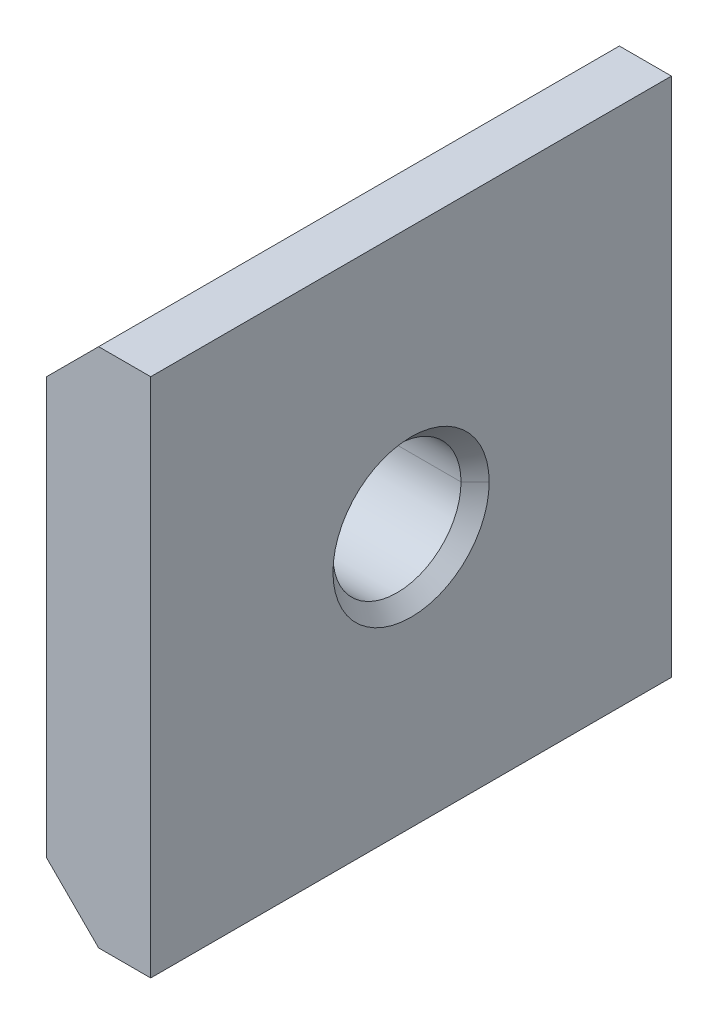
ISO-10303-21;
HEADER;
FILE_DESCRIPTION(('STEP AP214'),'2;1');
FILE_NAME('part.step','',(''),(''),'','','');
FILE_SCHEMA(('AUTOMOTIVE_DESIGN { 1 0 10303 214 1 1 1 1 }'));
ENDSEC;
DATA;
#1=APPLICATION_CONTEXT('core data for automotive mechanical design processes');
#2=APPLICATION_PROTOCOL_DEFINITION('international standard','automotive_design',2000,#1);
#3=PRODUCT_CONTEXT('',#1,'mechanical');
#4=PRODUCT('Part','Part','',(#3));
#5=PRODUCT_RELATED_PRODUCT_CATEGORY('part','',(#4));
#6=PRODUCT_DEFINITION_FORMATION('','',#4);
#7=PRODUCT_DEFINITION_CONTEXT('part definition',#1,'design');
#8=PRODUCT_DEFINITION('design','',#6,#7);
#9=PRODUCT_DEFINITION_SHAPE('','',#8);
#10=(LENGTH_UNIT() NAMED_UNIT(*) SI_UNIT(.MILLI.,.METRE.));
#11=(NAMED_UNIT(*) PLANE_ANGLE_UNIT() SI_UNIT($,.RADIAN.));
#12=(NAMED_UNIT(*) SI_UNIT($,.STERADIAN.) SOLID_ANGLE_UNIT());
#13=UNCERTAINTY_MEASURE_WITH_UNIT(LENGTH_MEASURE(1.E-05),#10,'distance_accuracy_value','');
#14=(GEOMETRIC_REPRESENTATION_CONTEXT(3) GLOBAL_UNCERTAINTY_ASSIGNED_CONTEXT((#13)) GLOBAL_UNIT_ASSIGNED_CONTEXT((#10,
#11,#12)) REPRESENTATION_CONTEXT('',''));
#15=CARTESIAN_POINT('',(0.,0.,0.));
#16=DIRECTION('',(0.,0.,1.));
#17=DIRECTION('',(1.,0.,0.));
#18=AXIS2_PLACEMENT_3D('',#15,#16,#17);
#19=CARTESIAN_POINT('',(0.,-5.,5.));
#20=DIRECTION('',(-1.,0.,0.));
#21=DIRECTION('',(0.,0.,1.));
#22=AXIS2_PLACEMENT_3D('',#19,#20,#21);
#23=PLANE('',#22);
#24=CARTESIAN_POINT('',(0.,0.,0.));
#25=DIRECTION('',(1.,0.,0.));
#26=DIRECTION('',(0.,0.,-1.));
#27=AXIS2_PLACEMENT_3D('',#24,#25,#26);
#28=CIRCLE('',#27,1.5);
#29=CARTESIAN_POINT('',(0.,0.,-1.5));
#30=VERTEX_POINT('',#29);
#31=CARTESIAN_POINT('',(-6.9022565440946E-13,0.,1.50000000000069));
#32=VERTEX_POINT('',#31);
#33=EDGE_CURVE('E10',#30,#32,#28,.T.);
#34=ORIENTED_EDGE('',*,*,#33,.F.);
#35=CARTESIAN_POINT('',(0.,0.,0.));
#36=DIRECTION('',(1.,0.,0.));
#37=DIRECTION('',(0.,0.,-1.));
#38=AXIS2_PLACEMENT_3D('',#35,#36,#37);
#39=CIRCLE('',#38,1.5);
#40=EDGE_CURVE('E24',#32,#30,#39,.T.);
#41=ORIENTED_EDGE('',*,*,#40,.F.);
#42=EDGE_LOOP('',(#34,#41));
#43=FACE_BOUND('',#42,.T.);
#44=DIRECTION('',(0.,1.,0.));
#45=VECTOR('',#44,1.);
#46=CARTESIAN_POINT('',(0.,-5.,-5.));
#47=LINE('',#46,#45);
#48=CARTESIAN_POINT('',(0.,-5.,-5.));
#49=VERTEX_POINT('',#48);
#50=CARTESIAN_POINT('',(0.,5.,-5.));
#51=VERTEX_POINT('',#50);
#52=EDGE_CURVE('E264',#49,#51,#47,.T.);
#53=ORIENTED_EDGE('',*,*,#52,.T.);
#54=DIRECTION('',(0.,0.,-1.));
#55=VECTOR('',#54,1.);
#56=CARTESIAN_POINT('',(0.,5.,5.));
#57=LINE('',#56,#55);
#58=CARTESIAN_POINT('',(0.,5.,5.));
#59=VERTEX_POINT('',#58);
#60=EDGE_CURVE('E259',#59,#51,#57,.T.);
#61=ORIENTED_EDGE('',*,*,#60,.F.);
#62=DIRECTION('',(0.,1.,0.));
#63=VECTOR('',#62,1.);
#64=CARTESIAN_POINT('',(0.,-5.,5.));
#65=LINE('',#64,#63);
#66=CARTESIAN_POINT('',(0.,-5.,5.));
#67=VERTEX_POINT('',#66);
#68=EDGE_CURVE('E254',#67,#59,#65,.T.);
#69=ORIENTED_EDGE('',*,*,#68,.F.);
#70=DIRECTION('',(0.,0.,-1.));
#71=VECTOR('',#70,1.);
#72=CARTESIAN_POINT('',(0.,-5.,5.));
#73=LINE('',#72,#71);
#74=EDGE_CURVE('E250',#67,#49,#73,.T.);
#75=ORIENTED_EDGE('',*,*,#74,.T.);
#76=EDGE_LOOP('',(#53,#61,#69,#75));
#77=FACE_BOUND('',#76,.T.);
#78=ADVANCED_FACE('F16',(#43,#77),#23,.F.);
#79=CARTESIAN_POINT('',(-1.,-5.,5.));
#80=DIRECTION('',(0.,1.,0.));
#81=DIRECTION('',(0.,0.,1.));
#82=AXIS2_PLACEMENT_3D('',#79,#80,#81);
#83=PLANE('',#82);
#84=DIRECTION('',(1.,0.,0.));
#85=VECTOR('',#84,1.);
#86=CARTESIAN_POINT('',(-1.,-5.,-5.));
#87=LINE('',#86,#85);
#88=CARTESIAN_POINT('',(-1.,-5.,-5.));
#89=VERTEX_POINT('',#88);
#90=EDGE_CURVE('E245',#89,#49,#87,.T.);
#91=ORIENTED_EDGE('',*,*,#90,.T.);
#92=ORIENTED_EDGE('',*,*,#74,.F.);
#93=DIRECTION('',(1.,0.,0.));
#94=VECTOR('',#93,1.);
#95=CARTESIAN_POINT('',(-1.,-5.,5.));
#96=LINE('',#95,#94);
#97=CARTESIAN_POINT('',(-1.,-5.,5.));
#98=VERTEX_POINT('',#97);
#99=EDGE_CURVE('E240',#98,#67,#96,.T.);
#100=ORIENTED_EDGE('',*,*,#99,.F.);
#101=DIRECTION('',(0.,0.,-1.));
#102=VECTOR('',#101,1.);
#103=CARTESIAN_POINT('',(-1.,-5.,5.));
#104=LINE('',#103,#102);
#105=EDGE_CURVE('E236',#98,#89,#104,.T.);
#106=ORIENTED_EDGE('',*,*,#105,.T.);
#107=EDGE_LOOP('',(#91,#92,#100,#106));
#108=FACE_BOUND('',#107,.T.);
#109=ADVANCED_FACE('F292',(#108),#83,.F.);
#110=CARTESIAN_POINT('',(-2.,-4.,5.));
#111=DIRECTION('',(0.707106781186548,0.707106781186548,0.));
#112=DIRECTION('',(-0.707106781186548,0.707106781186548,0.));
#113=AXIS2_PLACEMENT_3D('',#110,#111,#112);
#114=PLANE('',#113);
#115=DIRECTION('',(0.707106781186548,-0.707106781186548,0.));
#116=VECTOR('',#115,1.);
#117=CARTESIAN_POINT('',(-2.,-4.,-5.));
#118=LINE('',#117,#116);
#119=CARTESIAN_POINT('',(-2.,-4.,-5.));
#120=VERTEX_POINT('',#119);
#121=EDGE_CURVE('E231',#120,#89,#118,.T.);
#122=ORIENTED_EDGE('',*,*,#121,.T.);
#123=ORIENTED_EDGE('',*,*,#105,.F.);
#124=DIRECTION('',(0.707106781186548,-0.707106781186548,0.));
#125=VECTOR('',#124,1.);
#126=CARTESIAN_POINT('',(-2.,-4.,5.));
#127=LINE('',#126,#125);
#128=CARTESIAN_POINT('',(-2.,-4.,5.));
#129=VERTEX_POINT('',#128);
#130=EDGE_CURVE('E226',#129,#98,#127,.T.);
#131=ORIENTED_EDGE('',*,*,#130,.F.);
#132=DIRECTION('',(0.,0.,-1.));
#133=VECTOR('',#132,1.);
#134=CARTESIAN_POINT('',(-2.,-4.,5.));
#135=LINE('',#134,#133);
#136=EDGE_CURVE('E222',#129,#120,#135,.T.);
#137=ORIENTED_EDGE('',*,*,#136,.T.);
#138=EDGE_LOOP('',(#122,#123,#131,#137));
#139=FACE_BOUND('',#138,.T.);
#140=ADVANCED_FACE('F295',(#139),#114,.F.);
#141=CARTESIAN_POINT('',(-2.,4.,5.));
#142=DIRECTION('',(1.,0.,0.));
#143=DIRECTION('',(0.,0.,-1.));
#144=AXIS2_PLACEMENT_3D('',#141,#142,#143);
#145=PLANE('',#144);
#146=CARTESIAN_POINT('',(-2.,0.,0.));
#147=DIRECTION('',(1.,0.,0.));
#148=DIRECTION('',(0.,0.,-1.));
#149=AXIS2_PLACEMENT_3D('',#146,#147,#148);
#150=CIRCLE('',#149,2.15);
#151=CARTESIAN_POINT('',(-2.,0.,-2.15));
#152=VERTEX_POINT('',#151);
#153=CARTESIAN_POINT('',(-1.99999999999659,0.,2.14999999998408));
#154=VERTEX_POINT('',#153);
#155=EDGE_CURVE('E218',#152,#154,#150,.T.);
#156=ORIENTED_EDGE('',*,*,#155,.T.);
#157=CARTESIAN_POINT('',(-2.,0.,0.));
#158=DIRECTION('',(1.,0.,0.));
#159=DIRECTION('',(0.,0.,-1.));
#160=AXIS2_PLACEMENT_3D('',#157,#158,#159);
#161=CIRCLE('',#160,2.15);
#162=EDGE_CURVE('E214',#154,#152,#161,.T.);
#163=ORIENTED_EDGE('',*,*,#162,.T.);
#164=EDGE_LOOP('',(#156,#163));
#165=FACE_BOUND('',#164,.T.);
#166=DIRECTION('',(0.,-1.,0.));
#167=VECTOR('',#166,1.);
#168=CARTESIAN_POINT('',(-2.,4.,-5.));
#169=LINE('',#168,#167);
#170=CARTESIAN_POINT('',(-2.,4.,-5.));
#171=VERTEX_POINT('',#170);
#172=EDGE_CURVE('E209',#171,#120,#169,.T.);
#173=ORIENTED_EDGE('',*,*,#172,.T.);
#174=ORIENTED_EDGE('',*,*,#136,.F.);
#175=DIRECTION('',(0.,-1.,0.));
#176=VECTOR('',#175,1.);
#177=CARTESIAN_POINT('',(-2.,4.,5.));
#178=LINE('',#177,#176);
#179=CARTESIAN_POINT('',(-2.,4.,5.));
#180=VERTEX_POINT('',#179);
#181=EDGE_CURVE('E204',#180,#129,#178,.T.);
#182=ORIENTED_EDGE('',*,*,#181,.F.);
#183=DIRECTION('',(0.,0.,-1.));
#184=VECTOR('',#183,1.);
#185=CARTESIAN_POINT('',(-2.,4.,5.));
#186=LINE('',#185,#184);
#187=EDGE_CURVE('E200',#180,#171,#186,.T.);
#188=ORIENTED_EDGE('',*,*,#187,.T.);
#189=EDGE_LOOP('',(#173,#174,#182,#188));
#190=FACE_BOUND('',#189,.T.);
#191=ADVANCED_FACE('F298',(#165,#190),#145,.F.);
#192=CARTESIAN_POINT('',(-1.,5.,5.));
#193=DIRECTION('',(0.707106781186548,-0.707106781186548,0.));
#194=DIRECTION('',(0.707106781186548,0.707106781186548,0.));
#195=AXIS2_PLACEMENT_3D('',#192,#193,#194);
#196=PLANE('',#195);
#197=DIRECTION('',(-0.707106781186548,-0.707106781186548,0.));
#198=VECTOR('',#197,1.);
#199=CARTESIAN_POINT('',(-1.,5.,-5.));
#200=LINE('',#199,#198);
#201=CARTESIAN_POINT('',(-1.,5.,-5.));
#202=VERTEX_POINT('',#201);
#203=EDGE_CURVE('E195',#202,#171,#200,.T.);
#204=ORIENTED_EDGE('',*,*,#203,.T.);
#205=ORIENTED_EDGE('',*,*,#187,.F.);
#206=DIRECTION('',(-0.707106781186548,-0.707106781186548,0.));
#207=VECTOR('',#206,1.);
#208=CARTESIAN_POINT('',(-1.,5.,5.));
#209=LINE('',#208,#207);
#210=CARTESIAN_POINT('',(-1.,5.,5.));
#211=VERTEX_POINT('',#210);
#212=EDGE_CURVE('E190',#211,#180,#209,.T.);
#213=ORIENTED_EDGE('',*,*,#212,.F.);
#214=DIRECTION('',(0.,0.,-1.));
#215=VECTOR('',#214,1.);
#216=CARTESIAN_POINT('',(-1.,5.,5.));
#217=LINE('',#216,#215);
#218=EDGE_CURVE('E186',#211,#202,#217,.T.);
#219=ORIENTED_EDGE('',*,*,#218,.T.);
#220=EDGE_LOOP('',(#204,#205,#213,#219));
#221=FACE_BOUND('',#220,.T.);
#222=ADVANCED_FACE('F288',(#221),#196,.F.);
#223=CARTESIAN_POINT('',(0.,5.,5.));
#224=DIRECTION('',(0.,-1.,0.));
#225=DIRECTION('',(0.,0.,-1.));
#226=AXIS2_PLACEMENT_3D('',#223,#224,#225);
#227=PLANE('',#226);
#228=DIRECTION('',(-1.,0.,0.));
#229=VECTOR('',#228,1.);
#230=CARTESIAN_POINT('',(0.,5.,-5.));
#231=LINE('',#230,#229);
#232=EDGE_CURVE('E181',#51,#202,#231,.T.);
#233=ORIENTED_EDGE('',*,*,#232,.T.);
#234=ORIENTED_EDGE('',*,*,#218,.F.);
#235=DIRECTION('',(-1.,0.,0.));
#236=VECTOR('',#235,1.);
#237=CARTESIAN_POINT('',(0.,5.,5.));
#238=LINE('',#237,#236);
#239=EDGE_CURVE('E176',#59,#211,#238,.T.);
#240=ORIENTED_EDGE('',*,*,#239,.F.);
#241=ORIENTED_EDGE('',*,*,#60,.T.);
#242=EDGE_LOOP('',(#233,#234,#240,#241));
#243=FACE_BOUND('',#242,.T.);
#244=ADVANCED_FACE('F280',(#243),#227,.F.);
#245=CARTESIAN_POINT('',(0.,0.,5.));
#246=DIRECTION('',(0.,0.,1.));
#247=DIRECTION('',(1.,0.,0.));
#248=AXIS2_PLACEMENT_3D('',#245,#246,#247);
#249=PLANE('',#248);
#250=ORIENTED_EDGE('',*,*,#212,.T.);
#251=ORIENTED_EDGE('',*,*,#181,.T.);
#252=ORIENTED_EDGE('',*,*,#130,.T.);
#253=ORIENTED_EDGE('',*,*,#99,.T.);
#254=ORIENTED_EDGE('',*,*,#68,.T.);
#255=ORIENTED_EDGE('',*,*,#239,.T.);
#256=EDGE_LOOP('',(#250,#251,#252,#253,#254,#255));
#257=FACE_BOUND('',#256,.T.);
#258=ADVANCED_FACE('F290',(#257),#249,.T.);
#259=CARTESIAN_POINT('',(0.,0.,-5.));
#260=DIRECTION('',(0.,0.,1.));
#261=DIRECTION('',(1.,0.,0.));
#262=AXIS2_PLACEMENT_3D('',#259,#260,#261);
#263=PLANE('',#262);
#264=ORIENTED_EDGE('',*,*,#203,.F.);
#265=ORIENTED_EDGE('',*,*,#232,.F.);
#266=ORIENTED_EDGE('',*,*,#52,.F.);
#267=ORIENTED_EDGE('',*,*,#90,.F.);
#268=ORIENTED_EDGE('',*,*,#121,.F.);
#269=ORIENTED_EDGE('',*,*,#172,.F.);
#270=EDGE_LOOP('',(#264,#265,#266,#267,#268,#269));
#271=FACE_BOUND('',#270,.T.);
#272=ADVANCED_FACE('F283',(#271),#263,.F.);
#273=CARTESIAN_POINT('',(-2.7,0.,0.));
#274=DIRECTION('',(1.,0.,0.));
#275=DIRECTION('',(0.,1.,0.));
#276=AXIS2_PLACEMENT_3D('',#273,#274,#275);
#277=CONICAL_SURFACE('',#276,2.,0.2110933332);
#278=CARTESIAN_POINT('',(-2.7,0.,0.));
#279=DIRECTION('',(1.,0.,0.));
#280=DIRECTION('',(0.,0.,-1.));
#281=AXIS2_PLACEMENT_3D('',#278,#279,#280);
#282=CIRCLE('',#281,2.);
#283=CARTESIAN_POINT('',(-2.7,0.,2.));
#284=VERTEX_POINT('',#283);
#285=CARTESIAN_POINT('',(-2.7,0.,-2.));
#286=VERTEX_POINT('',#285);
#287=EDGE_CURVE('E172',#284,#286,#282,.T.);
#288=ORIENTED_EDGE('',*,*,#287,.T.);
#289=DIRECTION('',(0.977802414082175,0.,-0.209529088708632));
#290=VECTOR('',#289,1.);
#291=CARTESIAN_POINT('',(-2.7,0.,-2.));
#292=LINE('',#291,#290);
#293=EDGE_CURVE('E167',#286,#152,#292,.T.);
#294=ORIENTED_EDGE('',*,*,#293,.T.);
#295=ORIENTED_EDGE('',*,*,#162,.F.);
#296=DIRECTION('',(0.977802414082175,0.,0.209529088708632));
#297=VECTOR('',#296,1.);
#298=CARTESIAN_POINT('',(-2.7,0.,2.));
#299=LINE('',#298,#297);
#300=EDGE_CURVE('E162',#284,#154,#299,.T.);
#301=ORIENTED_EDGE('',*,*,#300,.F.);
#302=EDGE_LOOP('',(#288,#294,#295,#301));
#303=FACE_BOUND('',#302,.T.);
#304=ADVANCED_FACE('F358',(#303),#277,.T.);
#305=CARTESIAN_POINT('',(-2.7,0.,0.));
#306=DIRECTION('',(1.,0.,0.));
#307=DIRECTION('',(0.,-1.,0.));
#308=AXIS2_PLACEMENT_3D('',#305,#306,#307);
#309=CONICAL_SURFACE('',#308,2.,0.2110933332);
#310=ORIENTED_EDGE('',*,*,#155,.F.);
#311=ORIENTED_EDGE('',*,*,#293,.F.);
#312=CARTESIAN_POINT('',(-2.7,0.,0.));
#313=DIRECTION('',(1.,0.,0.));
#314=DIRECTION('',(0.,0.,-1.));
#315=AXIS2_PLACEMENT_3D('',#312,#313,#314);
#316=CIRCLE('',#315,2.);
#317=EDGE_CURVE('E157',#286,#284,#316,.T.);
#318=ORIENTED_EDGE('',*,*,#317,.T.);
#319=ORIENTED_EDGE('',*,*,#300,.T.);
#320=EDGE_LOOP('',(#310,#311,#318,#319));
#321=FACE_BOUND('',#320,.T.);
#322=ADVANCED_FACE('F367',(#321),#309,.T.);
#323=CARTESIAN_POINT('',(-2.7,0.,0.));
#324=DIRECTION('',(1.,0.,0.));
#325=DIRECTION('',(0.,0.,-1.));
#326=AXIS2_PLACEMENT_3D('',#323,#324,#325);
#327=PLANE('',#326);
#328=ORIENTED_EDGE('',*,*,#317,.F.);
#329=ORIENTED_EDGE('',*,*,#287,.F.);
#330=EDGE_LOOP('',(#328,#329));
#331=FACE_BOUND('',#330,.T.);
#332=CARTESIAN_POINT('',(-2.7,0.,0.));
#333=DIRECTION('',(1.,0.,0.));
#334=DIRECTION('',(0.,0.,-1.));
#335=AXIS2_PLACEMENT_3D('',#332,#333,#334);
#336=CIRCLE('',#335,1.5);
#337=CARTESIAN_POINT('',(-2.7,0.,-1.5));
#338=VERTEX_POINT('',#337);
#339=CARTESIAN_POINT('',(-2.7,0.,1.5));
#340=VERTEX_POINT('',#339);
#341=EDGE_CURVE('E153',#338,#340,#336,.T.);
#342=ORIENTED_EDGE('',*,*,#341,.T.);
#343=CARTESIAN_POINT('',(-2.7,0.,0.));
#344=DIRECTION('',(1.,0.,0.));
#345=DIRECTION('',(0.,0.,-1.));
#346=AXIS2_PLACEMENT_3D('',#343,#344,#345);
#347=CIRCLE('',#346,1.5);
#348=EDGE_CURVE('E149',#340,#338,#347,.T.);
#349=ORIENTED_EDGE('',*,*,#348,.T.);
#350=EDGE_LOOP('',(#342,#349));
#351=FACE_BOUND('',#350,.T.);
#352=ADVANCED_FACE('F377',(#331,#351),#327,.F.);
#353=CARTESIAN_POINT('',(-2.7,0.,0.));
#354=DIRECTION('',(-1.,0.,0.));
#355=DIRECTION('',(0.,1.,0.));
#356=AXIS2_PLACEMENT_3D('',#353,#354,#355);
#357=CONICAL_SURFACE('',#356,1.5,0.7853981634);
#358=ORIENTED_EDGE('',*,*,#348,.F.);
#359=DIRECTION('',(-0.707106781184744,0.,0.707106781188352));
#360=VECTOR('',#359,1.);
#361=CARTESIAN_POINT('',(-2.42950000000069,0.,1.22949999999931));
#362=LINE('',#361,#360);
#363=CARTESIAN_POINT('',(-2.42950000000069,0.,1.22949999999931));
#364=VERTEX_POINT('',#363);
#365=EDGE_CURVE('E144',#364,#340,#362,.T.);
#366=ORIENTED_EDGE('',*,*,#365,.F.);
#367=CARTESIAN_POINT('',(-2.4295,0.,0.));
#368=DIRECTION('',(1.,0.,0.));
#369=DIRECTION('',(0.,0.,-1.));
#370=AXIS2_PLACEMENT_3D('',#367,#368,#369);
#371=CIRCLE('',#370,1.2295);
#372=CARTESIAN_POINT('',(-2.4295,0.,-1.2295));
#373=VERTEX_POINT('',#372);
#374=EDGE_CURVE('E140',#364,#373,#371,.T.);
#375=ORIENTED_EDGE('',*,*,#374,.T.);
#376=DIRECTION('',(-0.707106781184744,0.,-0.707106781188352));
#377=VECTOR('',#376,1.);
#378=CARTESIAN_POINT('',(-2.42950000000069,0.,-1.22949999999931));
#379=LINE('',#378,#377);
#380=EDGE_CURVE('E128',#373,#338,#379,.T.);
#381=ORIENTED_EDGE('',*,*,#380,.T.);
#382=EDGE_LOOP('',(#358,#366,#375,#381));
#383=FACE_BOUND('',#382,.T.);
#384=ADVANCED_FACE('F387',(#383),#357,.F.);
#385=CARTESIAN_POINT('',(-2.7,0.,0.));
#386=DIRECTION('',(-1.,0.,0.));
#387=DIRECTION('',(0.,-1.,0.));
#388=AXIS2_PLACEMENT_3D('',#385,#386,#387);
#389=CONICAL_SURFACE('',#388,1.5,0.7853981634);
#390=CARTESIAN_POINT('',(-2.4295,0.,0.));
#391=DIRECTION('',(1.,0.,0.));
#392=DIRECTION('',(0.,0.,-1.));
#393=AXIS2_PLACEMENT_3D('',#390,#391,#392);
#394=CIRCLE('',#393,1.2295);
#395=EDGE_CURVE('E108',#373,#364,#394,.T.);
#396=ORIENTED_EDGE('',*,*,#395,.T.);
#397=ORIENTED_EDGE('',*,*,#365,.T.);
#398=ORIENTED_EDGE('',*,*,#341,.F.);
#399=ORIENTED_EDGE('',*,*,#380,.F.);
#400=EDGE_LOOP('',(#396,#397,#398,#399));
#401=FACE_BOUND('',#400,.T.);
#402=ADVANCED_FACE('F397',(#401),#389,.F.);
#403=CARTESIAN_POINT('',(0.,0.,0.));
#404=DIRECTION('',(-1.,0.,0.));
#405=DIRECTION('',(0.,-1.,0.));
#406=AXIS2_PLACEMENT_3D('',#403,#404,#405);
#407=CYLINDRICAL_SURFACE('',#406,1.2295);
#408=CARTESIAN_POINT('',(-0.2705,0.,0.));
#409=DIRECTION('',(1.,0.,0.));
#410=DIRECTION('',(0.,0.,-1.));
#411=AXIS2_PLACEMENT_3D('',#408,#409,#410);
#412=CIRCLE('',#411,1.2295);
#413=CARTESIAN_POINT('',(-0.2705,0.,-1.2295));
#414=VERTEX_POINT('',#413);
#415=CARTESIAN_POINT('',(-0.2705,0.,1.2295));
#416=VERTEX_POINT('',#415);
#417=EDGE_CURVE('E105',#414,#416,#412,.T.);
#418=ORIENTED_EDGE('',*,*,#417,.T.);
#419=DIRECTION('',(-1.,0.,0.));
#420=VECTOR('',#419,1.);
#421=CARTESIAN_POINT('',(-0.2705,0.,1.2295));
#422=LINE('',#421,#420);
#423=EDGE_CURVE('E111',#416,#364,#422,.T.);
#424=ORIENTED_EDGE('',*,*,#423,.T.);
#425=ORIENTED_EDGE('',*,*,#395,.F.);
#426=DIRECTION('',(-1.,0.,0.));
#427=VECTOR('',#426,1.);
#428=CARTESIAN_POINT('',(-0.2705,0.,-1.2295));
#429=LINE('',#428,#427);
#430=EDGE_CURVE('E100',#414,#373,#429,.T.);
#431=ORIENTED_EDGE('',*,*,#430,.F.);
#432=EDGE_LOOP('',(#418,#424,#425,#431));
#433=FACE_BOUND('',#432,.T.);
#434=ADVANCED_FACE('F102',(#433),#407,.F.);
#435=CARTESIAN_POINT('',(0.,0.,0.));
#436=DIRECTION('',(-1.,0.,0.));
#437=DIRECTION('',(0.,1.,0.));
#438=AXIS2_PLACEMENT_3D('',#435,#436,#437);
#439=CYLINDRICAL_SURFACE('',#438,1.2295);
#440=ORIENTED_EDGE('',*,*,#374,.F.);
#441=ORIENTED_EDGE('',*,*,#423,.F.);
#442=CARTESIAN_POINT('',(-0.2705,0.,0.));
#443=DIRECTION('',(1.,0.,0.));
#444=DIRECTION('',(0.,0.,-1.));
#445=AXIS2_PLACEMENT_3D('',#442,#443,#444);
#446=CIRCLE('',#445,1.2295);
#447=EDGE_CURVE('E112',#416,#414,#446,.T.);
#448=ORIENTED_EDGE('',*,*,#447,.T.);
#449=ORIENTED_EDGE('',*,*,#430,.T.);
#450=EDGE_LOOP('',(#440,#441,#448,#449));
#451=FACE_BOUND('',#450,.T.);
#452=ADVANCED_FACE('F116',(#451),#439,.F.);
#453=CARTESIAN_POINT('',(-0.2705,0.,0.));
#454=DIRECTION('',(1.,0.,0.));
#455=DIRECTION('',(0.,1.,0.));
#456=AXIS2_PLACEMENT_3D('',#453,#454,#455);
#457=CONICAL_SURFACE('',#456,1.2295,0.7853981634);
#458=ORIENTED_EDGE('',*,*,#447,.F.);
#459=DIRECTION('',(0.707106781184743,0.,0.707106781188352));
#460=VECTOR('',#459,1.);
#461=CARTESIAN_POINT('',(-0.2705,0.,1.2295));
#462=LINE('',#461,#460);
#463=EDGE_CURVE('E119',#416,#32,#462,.T.);
#464=ORIENTED_EDGE('',*,*,#463,.T.);
#465=ORIENTED_EDGE('',*,*,#40,.T.);
#466=DIRECTION('',(0.707106781184743,0.,-0.707106781188352));
#467=VECTOR('',#466,1.);
#468=CARTESIAN_POINT('',(-0.2705,0.,-1.2295));
#469=LINE('',#468,#467);
#470=EDGE_CURVE('E122',#414,#30,#469,.T.);
#471=ORIENTED_EDGE('',*,*,#470,.F.);
#472=EDGE_LOOP('',(#458,#464,#465,#471));
#473=FACE_BOUND('',#472,.T.);
#474=ADVANCED_FACE('F123',(#473),#457,.F.);
#475=CARTESIAN_POINT('',(-0.2705,0.,0.));
#476=DIRECTION('',(1.,0.,0.));
#477=DIRECTION('',(0.,-1.,0.));
#478=AXIS2_PLACEMENT_3D('',#475,#476,#477);
#479=CONICAL_SURFACE('',#478,1.2295,0.7853981634);
#480=ORIENTED_EDGE('',*,*,#33,.T.);
#481=ORIENTED_EDGE('',*,*,#463,.F.);
#482=ORIENTED_EDGE('',*,*,#417,.F.);
#483=ORIENTED_EDGE('',*,*,#470,.T.);
#484=EDGE_LOOP('',(#480,#481,#482,#483));
#485=FACE_BOUND('',#484,.T.);
#486=ADVANCED_FACE('F126',(#485),#479,.F.);
#487=CLOSED_SHELL('',(#78,#109,#140,#191,#222,#244,#258,#272,#304,#322,#352,#384,#402,#434,#452,
#474,#486));
#488=MANIFOLD_SOLID_BREP('B1',#487);
#489=ADVANCED_BREP_SHAPE_REPRESENTATION('',(#18,#488),#14);
#490=SHAPE_DEFINITION_REPRESENTATION(#9,#489);
ENDSEC;
END-ISO-10303-21;
